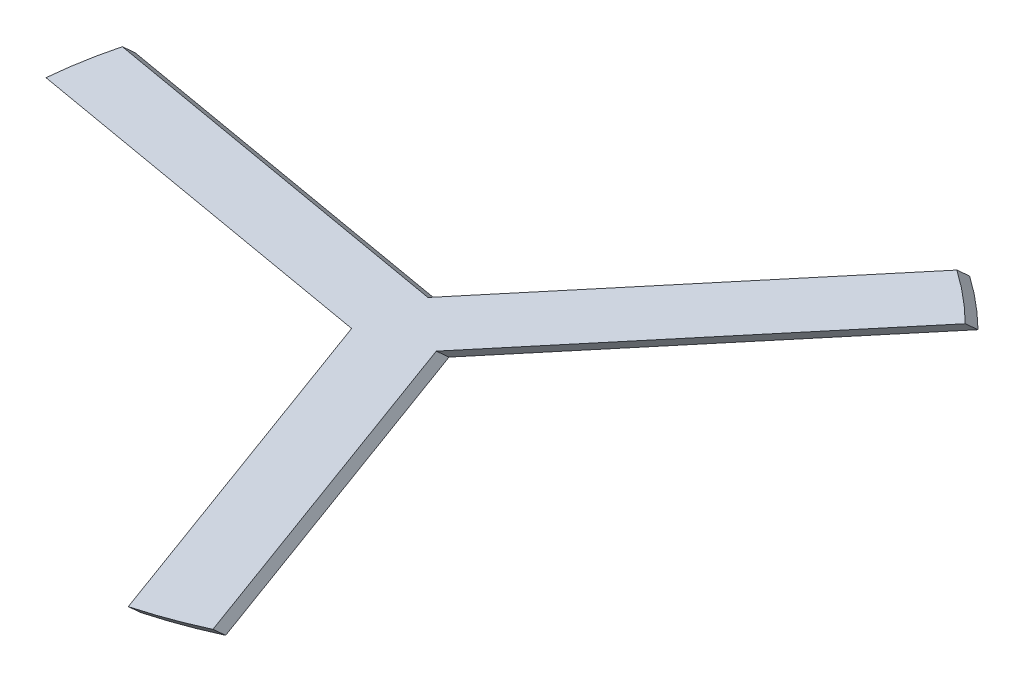
ISO-10303-21;
HEADER;
FILE_DESCRIPTION(('STEP AP214'),'2;1');
FILE_NAME('part.step','',(''),(''),'','','');
FILE_SCHEMA(('AUTOMOTIVE_DESIGN { 1 0 10303 214 1 1 1 1 }'));
ENDSEC;
DATA;
#1=APPLICATION_CONTEXT('core data for automotive mechanical design processes');
#2=APPLICATION_PROTOCOL_DEFINITION('international standard','automotive_design',2000,#1);
#3=PRODUCT_CONTEXT('',#1,'mechanical');
#4=PRODUCT('Part','Part','',(#3));
#5=PRODUCT_RELATED_PRODUCT_CATEGORY('part','',(#4));
#6=PRODUCT_DEFINITION_FORMATION('','',#4);
#7=PRODUCT_DEFINITION_CONTEXT('part definition',#1,'design');
#8=PRODUCT_DEFINITION('design','',#6,#7);
#9=PRODUCT_DEFINITION_SHAPE('','',#8);
#10=(LENGTH_UNIT() NAMED_UNIT(*) SI_UNIT(.MILLI.,.METRE.));
#11=(NAMED_UNIT(*) PLANE_ANGLE_UNIT() SI_UNIT($,.RADIAN.));
#12=(NAMED_UNIT(*) SI_UNIT($,.STERADIAN.) SOLID_ANGLE_UNIT());
#13=UNCERTAINTY_MEASURE_WITH_UNIT(LENGTH_MEASURE(1.E-05),#10,'distance_accuracy_value','');
#14=(GEOMETRIC_REPRESENTATION_CONTEXT(3) GLOBAL_UNCERTAINTY_ASSIGNED_CONTEXT((#13)) GLOBAL_UNIT_ASSIGNED_CONTEXT((#10,
#11,#12)) REPRESENTATION_CONTEXT('',''));
#15=CARTESIAN_POINT('',(0.,0.,0.));
#16=DIRECTION('',(0.,0.,1.));
#17=DIRECTION('',(1.,0.,0.));
#18=AXIS2_PLACEMENT_3D('',#15,#16,#17);
#19=CARTESIAN_POINT('',(31.7859974833175,-1.38777878078145E-13,-115.393451029299));
#20=DIRECTION('',(0.,1.,0.));
#21=DIRECTION('',(0.,0.,1.));
#22=AXIS2_PLACEMENT_3D('',#19,#20,#21);
#23=PLANE('',#22);
#24=DIRECTION('',(-0.985197929072484,0.,-0.171420653806037));
#25=VECTOR('',#24,1.);
#26=CARTESIAN_POINT('',(97.0972665834226,-1.38777878078145E-13,-490.753862005943));
#27=LINE('',#26,#25);
#28=CARTESIAN_POINT('',(-119.617167737024,-1.38777878078145E-13,-528.461340801997));
#29=VERTEX_POINT('',#28);
#30=CARTESIAN_POINT('',(-4391.56040051253,-1.38777878078145E-13,-1271.76304736778));
#31=VERTEX_POINT('',#30);
#32=EDGE_CURVE('E108',#29,#31,#27,.T.);
#33=ORIENTED_EDGE('',*,*,#32,.F.);
#34=DIRECTION('',(0.641053605465663,0.,-0.767496107429526));
#35=VECTOR('',#34,1.);
#36=CARTESIAN_POINT('',(-260.630019447333,-1.38777878078145E-13,-359.634874711718));
#37=LINE('',#36,#35);
#38=CARTESIAN_POINT('',(2660.07260921333,-1.38777878078145E-13,-3856.4218506276));
#39=VERTEX_POINT('',#38);
#40=EDGE_CURVE('E66',#39,#29,#37,.F.);
#41=ORIENTED_EDGE('',*,*,#40,.F.);
#42=CARTESIAN_POINT('',(31.7859974832121,-1.38777878078145E-13,-115.393451029398));
#43=DIRECTION('',(0.,1.,0.));
#44=DIRECTION('',(0.,0.,1.));
#45=AXIS2_PLACEMENT_3D('',#42,#43,#44);
#46=CIRCLE('',#45,4572.);
#47=CARTESIAN_POINT('',(3244.90464307467,-1.38777878078145E-13,-3367.93900326269));
#48=VERTEX_POINT('',#47);
#49=EDGE_CURVE('E72',#48,#39,#46,.T.);
#50=ORIENTED_EDGE('',*,*,#49,.F.);
#51=DIRECTION('',(0.641053605465586,0.,-0.76749610742959));
#52=VECTOR('',#51,1.);
#53=CARTESIAN_POINT('',(324.202014414398,-1.38777878078145E-13,128.847972653429));
#54=LINE('',#53,#52);
#55=CARTESIAN_POINT('',(465.214866124624,-1.38777878078145E-13,-39.9784934367838));
#56=VERTEX_POINT('',#55);
#57=EDGE_CURVE('E77',#56,#48,#54,.T.);
#58=ORIENTED_EDGE('',*,*,#57,.F.);
#59=DIRECTION('',(0.344144323606768,0.,0.938916761235649));
#60=VECTOR('',#59,1.);
#61=CARTESIAN_POINT('',(389.513283514304,-1.38777878078145E-13,-246.512438323553));
#62=LINE('',#61,#60);
#63=CARTESIAN_POINT('',(1957.4683219496,-1.38777878078145E-13,4031.28372295486));
#64=VERTEX_POINT('',#63);
#65=EDGE_CURVE('E156',#64,#56,#62,.F.);
#66=ORIENTED_EDGE('',*,*,#65,.F.);
#67=CARTESIAN_POINT('',(31.7859974832121,-1.38777878078145E-13,-115.393451029398));
#68=DIRECTION('',(0.,1.,0.));
#69=DIRECTION('',(0.,0.,1.));
#70=AXIS2_PLACEMENT_3D('',#67,#68,#69);
#71=CIRCLE('',#70,4572.00000000048);
#72=CARTESIAN_POINT('',(1242.01374988831,-1.38777878078145E-13,4293.52169754319));
#73=VERTEX_POINT('',#72);
#74=EDGE_CURVE('E148',#73,#64,#71,.T.);
#75=ORIENTED_EDGE('',*,*,#74,.F.);
#76=DIRECTION('',(0.344144323606888,0.,0.938916761235605));
#77=VECTOR('',#76,1.);
#78=CARTESIAN_POINT('',(-325.941288547545,-1.38777878078145E-13,15.7255362649607));
#79=LINE('',#78,#77);
#80=CARTESIAN_POINT('',(-250.23970593724,-1.38777878078145E-13,222.259481151607));
#81=VERTEX_POINT('',#80);
#82=EDGE_CURVE('E140',#81,#73,#79,.T.);
#83=ORIENTED_EDGE('',*,*,#82,.F.);
#84=DIRECTION('',(-0.985197929072459,0.,-0.171420653806182));
#85=VECTOR('',#84,1.);
#86=CARTESIAN_POINT('',(-33.5252716169017,-1.38777878078145E-13,259.966959947674));
#87=LINE('',#86,#85);
#88=CARTESIAN_POINT('',(-4522.1829387127,-1.38777878078145E-13,-521.042225414817));
#89=VERTEX_POINT('',#88);
#90=EDGE_CURVE('E131',#89,#81,#87,.F.);
#91=ORIENTED_EDGE('',*,*,#90,.F.);
#92=CARTESIAN_POINT('',(31.7859974832121,-1.38777878078145E-13,-115.393451029398));
#93=DIRECTION('',(0.,1.,0.));
#94=DIRECTION('',(0.,0.,1.));
#95=AXIS2_PLACEMENT_3D('',#92,#93,#94);
#96=CIRCLE('',#95,4571.99999999975);
#97=EDGE_CURVE('E110',#31,#89,#96,.T.);
#98=ORIENTED_EDGE('',*,*,#97,.F.);
#99=EDGE_LOOP('',(#33,#41,#50,#58,#66,#75,#83,#91,#98));
#100=FACE_BOUND('',#99,.T.);
#101=ADVANCED_FACE('F35',(#100),#23,.F.);
#102=CARTESIAN_POINT('',(0.,101.6,0.));
#103=DIRECTION('',(0.,1.,0.));
#104=DIRECTION('',(0.,0.,1.));
#105=AXIS2_PLACEMENT_3D('',#102,#103,#104);
#106=PLANE('',#105);
#107=DIRECTION('',(-0.985197929072484,0.,-0.171420653806037));
#108=VECTOR('',#107,1.);
#109=CARTESIAN_POINT('',(65.3112691001051,101.6,-375.360410976644));
#110=LINE('',#109,#108);
#111=CARTESIAN_POINT('',(-151.403165220342,101.6,-413.067889772698));
#112=VERTEX_POINT('',#111);
#113=CARTESIAN_POINT('',(-4423.34639799585,101.6,-1156.36959633848));
#114=VERTEX_POINT('',#113);
#115=EDGE_CURVE('E124',#112,#114,#110,.T.);
#116=ORIENTED_EDGE('',*,*,#115,.T.);
#117=CARTESIAN_POINT('',(-1.05365694468007E-10,101.6,-9.87153067621982E-11));
#118=DIRECTION('',(0.,1.,0.));
#119=DIRECTION('',(0.,0.,1.));
#120=AXIS2_PLACEMENT_3D('',#117,#118,#119);
#121=CIRCLE('',#120,4571.99999999975);
#122=CARTESIAN_POINT('',(-4553.96893619602,101.6,-405.648774385518));
#123=VERTEX_POINT('',#122);
#124=EDGE_CURVE('E132',#114,#123,#121,.T.);
#125=ORIENTED_EDGE('',*,*,#124,.T.);
#126=DIRECTION('',(-0.985197929072459,0.,-0.171420653806182));
#127=VECTOR('',#126,1.);
#128=CARTESIAN_POINT('',(-65.3112691002192,101.6,375.360410976973));
#129=LINE('',#128,#127);
#130=CARTESIAN_POINT('',(-282.025703420558,101.6,337.652932180906));
#131=VERTEX_POINT('',#130);
#132=EDGE_CURVE('E137',#123,#131,#129,.F.);
#133=ORIENTED_EDGE('',*,*,#132,.T.);
#134=DIRECTION('',(0.344144323606888,0.,0.938916761235605));
#135=VECTOR('',#134,1.);
#136=CARTESIAN_POINT('',(-357.727286030862,101.6,131.11898729426));
#137=LINE('',#136,#135);
#138=CARTESIAN_POINT('',(1210.22775240499,101.6,4408.91514857249));
#139=VERTEX_POINT('',#138);
#140=EDGE_CURVE('E145',#131,#139,#137,.T.);
#141=ORIENTED_EDGE('',*,*,#140,.T.);
#142=CARTESIAN_POINT('',(-1.05365694468007E-10,101.6,-9.87153067621982E-11));
#143=DIRECTION('',(0.,1.,0.));
#144=DIRECTION('',(0.,0.,1.));
#145=AXIS2_PLACEMENT_3D('',#142,#143,#144);
#146=CIRCLE('',#145,4572.00000000048);
#147=CARTESIAN_POINT('',(1925.68232446628,101.6,4146.67717398416));
#148=VERTEX_POINT('',#147);
#149=EDGE_CURVE('E153',#139,#148,#146,.T.);
#150=ORIENTED_EDGE('',*,*,#149,.T.);
#151=DIRECTION('',(0.344144323606768,0.,0.938916761235649));
#152=VECTOR('',#151,1.);
#153=CARTESIAN_POINT('',(357.727286030986,101.6,-131.118987294253));
#154=LINE('',#153,#152);
#155=CARTESIAN_POINT('',(433.428868641306,101.6,75.4149575925155));
#156=VERTEX_POINT('',#155);
#157=EDGE_CURVE('E161',#148,#156,#154,.F.);
#158=ORIENTED_EDGE('',*,*,#157,.T.);
#159=DIRECTION('',(0.641053605465586,0.,-0.76749610742959));
#160=VECTOR('',#159,1.);
#161=CARTESIAN_POINT('',(292.416016931081,101.6,244.241423682728));
#162=LINE('',#161,#160);
#163=CARTESIAN_POINT('',(3213.11864559135,101.6,-3252.54555223339));
#164=VERTEX_POINT('',#163);
#165=EDGE_CURVE('E54',#156,#164,#162,.T.);
#166=ORIENTED_EDGE('',*,*,#165,.T.);
#167=CARTESIAN_POINT('',(-1.05365694468007E-10,101.6,-9.87153067621982E-11));
#168=DIRECTION('',(0.,1.,0.));
#169=DIRECTION('',(0.,0.,1.));
#170=AXIS2_PLACEMENT_3D('',#167,#168,#169);
#171=CIRCLE('',#170,4572.);
#172=CARTESIAN_POINT('',(2628.28661173001,101.6,-3741.0283995983));
#173=VERTEX_POINT('',#172);
#174=EDGE_CURVE('E48',#164,#173,#171,.T.);
#175=ORIENTED_EDGE('',*,*,#174,.T.);
#176=DIRECTION('',(0.641053605465663,0.,-0.767496107429526));
#177=VECTOR('',#176,1.);
#178=CARTESIAN_POINT('',(-292.416016930651,101.6,-244.241423682419));
#179=LINE('',#178,#177);
#180=EDGE_CURVE('E11',#173,#112,#179,.F.);
#181=ORIENTED_EDGE('',*,*,#180,.T.);
#182=EDGE_LOOP('',(#116,#125,#133,#141,#150,#158,#166,#175,#181));
#183=FACE_BOUND('',#182,.T.);
#184=ADVANCED_FACE('F199',(#183),#106,.T.);
#185=CARTESIAN_POINT('',(97.0972665834226,-1.38777878078145E-13,-490.753862005943));
#186=DIRECTION('',(0.111233702798847,0.760879470100552,-0.639288272488367));
#187=DIRECTION('',(0.,0.64328029232347,0.765630763167358));
#188=AXIS2_PLACEMENT_3D('',#185,#186,#187);
#189=PLANE('',#188);
#190=DIRECTION('',(-0.202460397215547,0.647139557847602,0.734996721236315));
#191=VECTOR('',#190,1.);
#192=CARTESIAN_POINT('',(-4391.56040051253,-1.38777878078145E-13,-1271.76304736778));
#193=LINE('',#192,#191);
#194=EDGE_CURVE('E126',#31,#114,#193,.T.);
#195=ORIENTED_EDGE('',*,*,#194,.T.);
#196=ORIENTED_EDGE('',*,*,#115,.F.);
#197=DIRECTION('',(-0.202460397215547,0.647139557847602,0.734996721236315));
#198=VECTOR('',#197,1.);
#199=CARTESIAN_POINT('',(-119.617167737024,-1.38777878078145E-13,-528.461340801997));
#200=LINE('',#199,#198);
#201=EDGE_CURVE('E120',#29,#112,#200,.T.);
#202=ORIENTED_EDGE('',*,*,#201,.F.);
#203=ORIENTED_EDGE('',*,*,#32,.T.);
#204=EDGE_LOOP('',(#195,#196,#202,#203));
#205=FACE_BOUND('',#204,.T.);
#206=ADVANCED_FACE('F123',(#205),#189,.T.);
#207=CARTESIAN_POINT('',(-4391.56040051253,-1.38777878078145E-13,-1271.76304736778));
#208=CARTESIAN_POINT('',(-4423.34639799585,101.6,-1156.36959633849));
#209=CARTESIAN_POINT('',(-4455.95247126372,-1.39100430778977E-13,-1025.45041936489));
#210=CARTESIAN_POINT('',(-4487.73846874704,101.6,-910.056968335596));
#211=CARTESIAN_POINT('',(-4499.59451658273,-1.39100430778977E-13,-774.62852763754));
#212=CARTESIAN_POINT('',(-4531.38051406605,101.6,-659.23507660824));
#213=CARTESIAN_POINT('',(-4522.1829387127,-1.38777878078145E-13,-521.042225414818));
#214=CARTESIAN_POINT('',(-4553.96893619602,101.6,-405.648774385518));
#215=(BOUNDED_SURFACE() B_SPLINE_SURFACE(3,1,((#207,#208),(#209,#210),(#211,#212),(#213,#214)),
.UNSPECIFIED.,.F.,.F.,.F.) B_SPLINE_SURFACE_WITH_KNOTS((4,4),(2,2),(0.,1.),(0.,1.),
.UNSPECIFIED.) GEOMETRIC_REPRESENTATION_ITEM() RATIONAL_B_SPLINE_SURFACE(((1.,1.),
(0.997681152394523,0.997681152394523),(0.997681152394523,0.997681152394523),(1.,1.))) REPRESENTATION_ITEM('') SURFACE());
#216=DIRECTION('',(-0.202460397215547,0.647139557847602,0.734996721236315));
#217=VECTOR('',#216,1.);
#218=CARTESIAN_POINT('',(-4522.1829387127,-1.38777878078145E-13,-521.042225414817));
#219=LINE('',#218,#217);
#220=EDGE_CURVE('E134',#89,#123,#219,.T.);
#221=ORIENTED_EDGE('',*,*,#220,.T.);
#222=ORIENTED_EDGE('',*,*,#124,.F.);
#223=ORIENTED_EDGE('',*,*,#194,.F.);
#224=ORIENTED_EDGE('',*,*,#97,.T.);
#225=EDGE_LOOP('',(#221,#222,#223,#224));
#226=FACE_BOUND('',#225,.T.);
#227=ADVANCED_FACE('F198',(#226),#215,.T.);
#228=CARTESIAN_POINT('',(-33.5252716169017,-1.38777878078145E-13,259.966959947674));
#229=DIRECTION('',(-0.11123370279894,-0.760879470100557,0.639288272488346));
#230=DIRECTION('',(0.,-0.643280292323455,-0.76563076316737));
#231=AXIS2_PLACEMENT_3D('',#228,#229,#230);
#232=PLANE('',#231);
#233=DIRECTION('',(-0.202460397215547,0.647139557847602,0.734996721236315));
#234=VECTOR('',#233,1.);
#235=CARTESIAN_POINT('',(-250.23970593724,-1.38777878078145E-13,222.259481151607));
#236=LINE('',#235,#234);
#237=EDGE_CURVE('E142',#81,#131,#236,.T.);
#238=ORIENTED_EDGE('',*,*,#237,.T.);
#239=ORIENTED_EDGE('',*,*,#132,.F.);
#240=ORIENTED_EDGE('',*,*,#220,.F.);
#241=ORIENTED_EDGE('',*,*,#90,.T.);
#242=EDGE_LOOP('',(#238,#239,#240,#241));
#243=FACE_BOUND('',#242,.T.);
#244=ADVANCED_FACE('F194',(#243),#232,.T.);
#245=CARTESIAN_POINT('',(-325.941288547545,-1.38777878078145E-13,15.7255362649607));
#246=DIRECTION('',(-0.774750446859805,-0.56490858554233,0.283971891339787));
#247=DIRECTION('',(0.589162886657616,-0.808014290087289,0.));
#248=AXIS2_PLACEMENT_3D('',#245,#246,#247);
#249=PLANE('',#248);
#250=DIRECTION('',(-0.202460397215547,0.647139557847602,0.734996721236315));
#251=VECTOR('',#250,1.);
#252=CARTESIAN_POINT('',(1242.01374988831,-1.38777878078145E-13,4293.52169754319));
#253=LINE('',#252,#251);
#254=EDGE_CURVE('E150',#73,#139,#253,.T.);
#255=ORIENTED_EDGE('',*,*,#254,.T.);
#256=ORIENTED_EDGE('',*,*,#140,.F.);
#257=ORIENTED_EDGE('',*,*,#237,.F.);
#258=ORIENTED_EDGE('',*,*,#82,.T.);
#259=EDGE_LOOP('',(#255,#256,#257,#258));
#260=FACE_BOUND('',#259,.T.);
#261=ADVANCED_FACE('F190',(#260),#249,.T.);
#262=CARTESIAN_POINT('',(1242.01374988831,-1.38777878078145E-13,4293.52169754319));
#263=CARTESIAN_POINT('',(1210.22775240499,101.6,4408.91514857249));
#264=CARTESIAN_POINT('',(1487.52277838731,-1.39100430778977E-13,4226.13055261456));
#265=CARTESIAN_POINT('',(1455.73678090399,101.6,4341.52400364386));
#266=CARTESIAN_POINT('',(1726.56193110798,-1.39100430778977E-13,4138.51472667025));
#267=CARTESIAN_POINT('',(1694.77593362466,101.6,4253.90817769955));
#268=CARTESIAN_POINT('',(1957.4683219496,-1.38777878078145E-13,4031.28372295486));
#269=CARTESIAN_POINT('',(1925.68232446628,101.6,4146.67717398416));
#270=(BOUNDED_SURFACE() B_SPLINE_SURFACE(3,1,((#262,#263),(#264,#265),(#266,#267),(#268,#269)),
.UNSPECIFIED.,.F.,.F.,.F.) B_SPLINE_SURFACE_WITH_KNOTS((4,4),(2,2),(0.,1.),(0.,1.),
.UNSPECIFIED.) GEOMETRIC_REPRESENTATION_ITEM() RATIONAL_B_SPLINE_SURFACE(((1.,1.),
(0.997681152394524,0.997681152394524),(0.997681152394524,0.997681152394524),(1.,1.))) REPRESENTATION_ITEM('') SURFACE());
#271=DIRECTION('',(-0.202460397215547,0.647139557847602,0.734996721236315));
#272=VECTOR('',#271,1.);
#273=CARTESIAN_POINT('',(1957.4683219496,-1.38777878078145E-13,4031.28372295486));
#274=LINE('',#273,#272);
#275=EDGE_CURVE('E158',#64,#148,#274,.T.);
#276=ORIENTED_EDGE('',*,*,#275,.T.);
#277=ORIENTED_EDGE('',*,*,#149,.F.);
#278=ORIENTED_EDGE('',*,*,#254,.F.);
#279=ORIENTED_EDGE('',*,*,#74,.T.);
#280=EDGE_LOOP('',(#276,#277,#278,#279));
#281=FACE_BOUND('',#280,.T.);
#282=ADVANCED_FACE('F186',(#281),#270,.T.);
#283=CARTESIAN_POINT('',(389.513283514304,-1.38777878078145E-13,-246.512438323553));
#284=DIRECTION('',(0.774750446859886,0.564908585542261,-0.283971891339704));
#285=DIRECTION('',(-0.589162886657529,0.808014290087352,0.));
#286=AXIS2_PLACEMENT_3D('',#283,#284,#285);
#287=PLANE('',#286);
#288=DIRECTION('',(-0.202460397215547,0.647139557847602,0.734996721236315));
#289=VECTOR('',#288,1.);
#290=CARTESIAN_POINT('',(465.214866124624,-1.38777878078145E-13,-39.9784934367838));
#291=LINE('',#290,#289);
#292=EDGE_CURVE('E164',#56,#156,#291,.T.);
#293=ORIENTED_EDGE('',*,*,#292,.T.);
#294=ORIENTED_EDGE('',*,*,#157,.F.);
#295=ORIENTED_EDGE('',*,*,#275,.F.);
#296=ORIENTED_EDGE('',*,*,#65,.T.);
#297=EDGE_LOOP('',(#293,#294,#295,#296));
#298=FACE_BOUND('',#297,.T.);
#299=ADVANCED_FACE('F182',(#298),#287,.T.);
#300=CARTESIAN_POINT('',(324.202014414398,-1.38777878078145E-13,128.847972653429));
#301=DIRECTION('',(0.689756381098872,-0.438543547111758,0.576121247672766));
#302=DIRECTION('',(0.641053605465586,0.,-0.76749610742959));
#303=AXIS2_PLACEMENT_3D('',#300,#301,#302);
#304=PLANE('',#303);
#305=DIRECTION('',(-0.202460397215547,0.647139557847602,0.734996721236315));
#306=VECTOR('',#305,1.);
#307=CARTESIAN_POINT('',(3244.90464307467,-1.38777878078145E-13,-3367.93900326269));
#308=LINE('',#307,#306);
#309=EDGE_CURVE('E169',#48,#164,#308,.T.);
#310=ORIENTED_EDGE('',*,*,#309,.T.);
#311=ORIENTED_EDGE('',*,*,#165,.F.);
#312=ORIENTED_EDGE('',*,*,#292,.F.);
#313=ORIENTED_EDGE('',*,*,#57,.T.);
#314=EDGE_LOOP('',(#310,#311,#312,#313));
#315=FACE_BOUND('',#314,.T.);
#316=ADVANCED_FACE('F178',(#315),#304,.T.);
#317=CARTESIAN_POINT('',(3244.90464307467,-1.38777878078145E-13,-3367.93900326269));
#318=CARTESIAN_POINT('',(3213.11864559135,101.6,-3252.54555223339));
#319=CARTESIAN_POINT('',(3063.78768532679,-1.39100430778977E-13,-3546.86048633705));
#320=CARTESIAN_POINT('',(3032.00168784348,101.6,-3431.46703530775));
#321=CARTESIAN_POINT('',(2868.39057792507,-1.39100430778977E-13,-3710.06655212019));
#322=CARTESIAN_POINT('',(2836.60458044175,101.6,-3594.67310109089));
#323=CARTESIAN_POINT('',(2660.07260921333,-1.38777878078145E-13,-3856.42185062759));
#324=CARTESIAN_POINT('',(2628.28661173001,101.6,-3741.0283995983));
#325=(BOUNDED_SURFACE() B_SPLINE_SURFACE(3,1,((#317,#318),(#319,#320),(#321,#322),(#323,#324)),
.UNSPECIFIED.,.F.,.F.,.F.) B_SPLINE_SURFACE_WITH_KNOTS((4,4),(2,2),(0.,1.),(0.,1.),
.UNSPECIFIED.) GEOMETRIC_REPRESENTATION_ITEM() RATIONAL_B_SPLINE_SURFACE(((1.,1.),
(0.997681152394522,0.997681152394522),(0.997681152394522,0.997681152394522),(1.,1.))) REPRESENTATION_ITEM('') SURFACE());
#326=DIRECTION('',(-0.202460397215547,0.647139557847602,0.734996721236315));
#327=VECTOR('',#326,1.);
#328=CARTESIAN_POINT('',(2660.07260921333,-1.38777878078145E-13,-3856.4218506276));
#329=LINE('',#328,#327);
#330=EDGE_CURVE('E42',#39,#173,#329,.T.);
#331=ORIENTED_EDGE('',*,*,#330,.T.);
#332=ORIENTED_EDGE('',*,*,#174,.F.);
#333=ORIENTED_EDGE('',*,*,#309,.F.);
#334=ORIENTED_EDGE('',*,*,#49,.T.);
#335=EDGE_LOOP('',(#331,#332,#333,#334));
#336=FACE_BOUND('',#335,.T.);
#337=ADVANCED_FACE('F175',(#336),#325,.T.);
#338=CARTESIAN_POINT('',(-260.630019447333,-1.38777878078145E-13,-359.634874711718));
#339=DIRECTION('',(-0.689756381098786,0.438543547111836,-0.576121247672811));
#340=DIRECTION('',(-0.641053605465663,0.,0.767496107429526));
#341=AXIS2_PLACEMENT_3D('',#338,#339,#340);
#342=PLANE('',#341);
#343=ORIENTED_EDGE('',*,*,#180,.F.);
#344=ORIENTED_EDGE('',*,*,#330,.F.);
#345=ORIENTED_EDGE('',*,*,#40,.T.);
#346=ORIENTED_EDGE('',*,*,#201,.T.);
#347=EDGE_LOOP('',(#343,#344,#345,#346));
#348=FACE_BOUND('',#347,.T.);
#349=ADVANCED_FACE('F119',(#348),#342,.T.);
#350=CLOSED_SHELL('',(#101,#184,#206,#227,#244,#261,#282,#299,#316,#337,#349));
#351=MANIFOLD_SOLID_BREP('B2',#350);
#352=ADVANCED_BREP_SHAPE_REPRESENTATION('',(#18,#351),#14);
#353=SHAPE_DEFINITION_REPRESENTATION(#9,#352);
ENDSEC;
END-ISO-10303-21;
